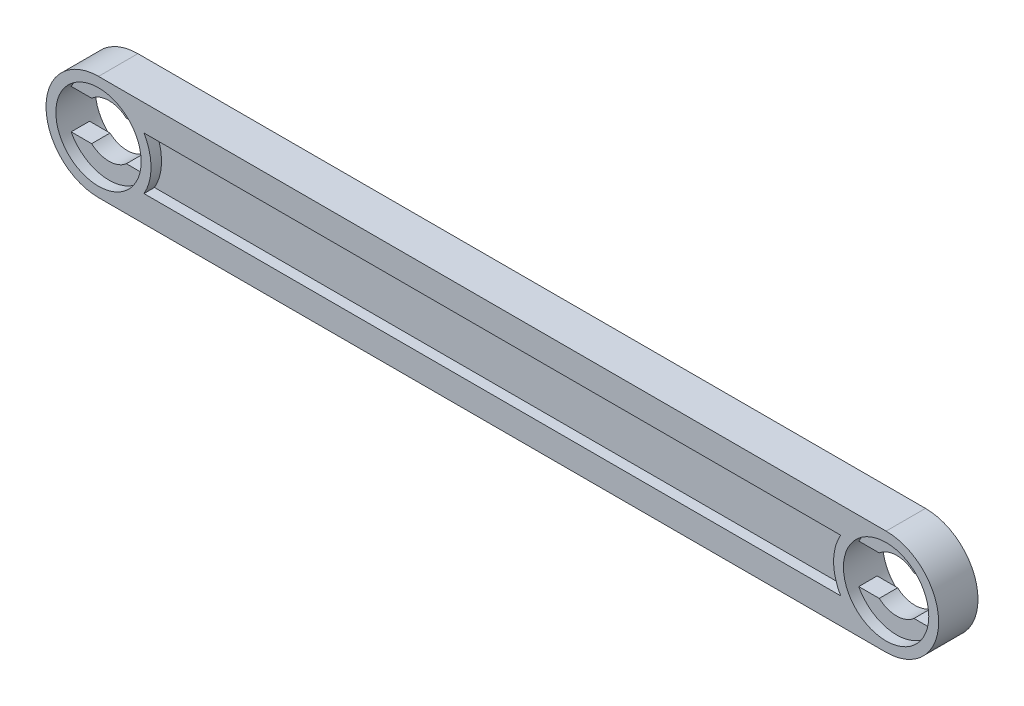
ISO-10303-21;
HEADER;
FILE_DESCRIPTION(('STEP AP214'),'2;1');
FILE_NAME('part.step','',(''),(''),'','','');
FILE_SCHEMA(('AUTOMOTIVE_DESIGN { 1 0 10303 214 1 1 1 1 }'));
ENDSEC;
DATA;
#1=APPLICATION_CONTEXT('core data for automotive mechanical design processes');
#2=APPLICATION_PROTOCOL_DEFINITION('international standard','automotive_design',2000,#1);
#3=PRODUCT_CONTEXT('',#1,'mechanical');
#4=PRODUCT('Part','Part','',(#3));
#5=PRODUCT_RELATED_PRODUCT_CATEGORY('part','',(#4));
#6=PRODUCT_DEFINITION_FORMATION('','',#4);
#7=PRODUCT_DEFINITION_CONTEXT('part definition',#1,'design');
#8=PRODUCT_DEFINITION('design','',#6,#7);
#9=PRODUCT_DEFINITION_SHAPE('','',#8);
#10=(LENGTH_UNIT() NAMED_UNIT(*) SI_UNIT(.MILLI.,.METRE.));
#11=(NAMED_UNIT(*) PLANE_ANGLE_UNIT() SI_UNIT($,.RADIAN.));
#12=(NAMED_UNIT(*) SI_UNIT($,.STERADIAN.) SOLID_ANGLE_UNIT());
#13=UNCERTAINTY_MEASURE_WITH_UNIT(LENGTH_MEASURE(1.E-05),#10,'distance_accuracy_value','');
#14=(GEOMETRIC_REPRESENTATION_CONTEXT(3) GLOBAL_UNCERTAINTY_ASSIGNED_CONTEXT((#13)) GLOBAL_UNIT_ASSIGNED_CONTEXT((#10,
#11,#12)) REPRESENTATION_CONTEXT('',''));
#15=CARTESIAN_POINT('',(0.,0.,0.));
#16=DIRECTION('',(0.,0.,1.));
#17=DIRECTION('',(1.,0.,0.));
#18=AXIS2_PLACEMENT_3D('',#15,#16,#17);
#19=CARTESIAN_POINT('',(0.,0.,0.));
#20=DIRECTION('',(0.,0.,1.));
#21=DIRECTION('',(1.,0.,0.));
#22=AXIS2_PLACEMENT_3D('',#19,#20,#21);
#23=PLANE('',#22);
#24=CARTESIAN_POINT('',(60.,0.,0.));
#25=DIRECTION('',(0.,0.,-1.));
#26=DIRECTION('',(1.,0.,0.));
#27=AXIS2_PLACEMENT_3D('',#24,#25,#26);
#28=CIRCLE('',#27,4.00000000000001);
#29=CARTESIAN_POINT('',(56.5358983848622,-2.,0.));
#30=VERTEX_POINT('',#29);
#31=CARTESIAN_POINT('',(56.5358983848622,2.,0.));
#32=VERTEX_POINT('',#31);
#33=EDGE_CURVE('E57',#30,#32,#28,.T.);
#34=ORIENTED_EDGE('',*,*,#33,.F.);
#35=DIRECTION('',(1.,0.,0.));
#36=VECTOR('',#35,1.);
#37=CARTESIAN_POINT('',(3.46410161513775,-2.,0.));
#38=LINE('',#37,#36);
#39=CARTESIAN_POINT('',(3.46410161513775,-2.,0.));
#40=VERTEX_POINT('',#39);
#41=EDGE_CURVE('E261',#40,#30,#38,.T.);
#42=ORIENTED_EDGE('',*,*,#41,.F.);
#43=CARTESIAN_POINT('',(0.,0.,0.));
#44=DIRECTION('',(0.,0.,-1.));
#45=DIRECTION('',(1.,0.,0.));
#46=AXIS2_PLACEMENT_3D('',#43,#44,#45);
#47=CIRCLE('',#46,4.);
#48=CARTESIAN_POINT('',(3.46410161513775,2.,0.));
#49=VERTEX_POINT('',#48);
#50=EDGE_CURVE('E275',#49,#40,#47,.T.);
#51=ORIENTED_EDGE('',*,*,#50,.F.);
#52=DIRECTION('',(-1.,0.,0.));
#53=VECTOR('',#52,1.);
#54=CARTESIAN_POINT('',(3.46410161513775,2.,0.));
#55=LINE('',#54,#53);
#56=EDGE_CURVE('E272',#32,#49,#55,.T.);
#57=ORIENTED_EDGE('',*,*,#56,.F.);
#58=EDGE_LOOP('',(#34,#42,#51,#57));
#59=FACE_BOUND('',#58,.T.);
#60=CARTESIAN_POINT('',(0.,0.,0.));
#61=DIRECTION('',(0.,0.,1.));
#62=DIRECTION('',(1.,0.,0.));
#63=AXIS2_PLACEMENT_3D('',#60,#61,#62);
#64=CIRCLE('',#63,4.);
#65=CARTESIAN_POINT('',(0.,4.,0.));
#66=VERTEX_POINT('',#65);
#67=CARTESIAN_POINT('',(0.,-4.,0.));
#68=VERTEX_POINT('',#67);
#69=EDGE_CURVE('E393',#66,#68,#64,.T.);
#70=ORIENTED_EDGE('',*,*,#69,.T.);
#71=DIRECTION('',(1.,0.,0.));
#72=VECTOR('',#71,1.);
#73=CARTESIAN_POINT('',(0.,-4.,0.));
#74=LINE('',#73,#72);
#75=CARTESIAN_POINT('',(60.,-4.,0.));
#76=VERTEX_POINT('',#75);
#77=EDGE_CURVE('E423',#68,#76,#74,.T.);
#78=ORIENTED_EDGE('',*,*,#77,.T.);
#79=CARTESIAN_POINT('',(60.,0.,0.));
#80=DIRECTION('',(0.,0.,1.));
#81=DIRECTION('',(1.,0.,0.));
#82=AXIS2_PLACEMENT_3D('',#79,#80,#81);
#83=CIRCLE('',#82,4.);
#84=CARTESIAN_POINT('',(60.,4.,0.));
#85=VERTEX_POINT('',#84);
#86=EDGE_CURVE('E426',#76,#85,#83,.T.);
#87=ORIENTED_EDGE('',*,*,#86,.T.);
#88=DIRECTION('',(-1.,0.,0.));
#89=VECTOR('',#88,1.);
#90=CARTESIAN_POINT('',(0.,4.,0.));
#91=LINE('',#90,#89);
#92=EDGE_CURVE('E411',#85,#66,#91,.T.);
#93=ORIENTED_EDGE('',*,*,#92,.T.);
#94=EDGE_LOOP('',(#70,#78,#87,#93));
#95=FACE_BOUND('',#94,.T.);
#96=CARTESIAN_POINT('',(0.,0.,0.));
#97=DIRECTION('',(0.,0.,1.));
#98=DIRECTION('',(1.,0.,0.));
#99=AXIS2_PLACEMENT_3D('',#96,#97,#98);
#100=CIRCLE('',#99,3.25);
#101=CARTESIAN_POINT('',(3.25,0.,0.));
#102=VERTEX_POINT('',#101);
#103=EDGE_CURVE('E387',#102,#102,#100,.T.);
#104=ORIENTED_EDGE('',*,*,#103,.F.);
#105=EDGE_LOOP('',(#104));
#106=FACE_BOUND('',#105,.T.);
#107=CARTESIAN_POINT('',(60.,0.,0.));
#108=DIRECTION('',(0.,0.,-1.));
#109=DIRECTION('',(-1.,0.,0.));
#110=AXIS2_PLACEMENT_3D('',#107,#108,#109);
#111=CIRCLE('',#110,3.25);
#112=CARTESIAN_POINT('',(56.75,0.,0.));
#113=VERTEX_POINT('',#112);
#114=EDGE_CURVE('E324',#113,#113,#111,.T.);
#115=ORIENTED_EDGE('',*,*,#114,.T.);
#116=EDGE_LOOP('',(#115));
#117=FACE_BOUND('',#116,.T.);
#118=ADVANCED_FACE('F34',(#59,#95,#106,#117),#23,.T.);
#119=CARTESIAN_POINT('',(62.8831406486677,-1.5,-3.001));
#120=DIRECTION('',(0.,1.,0.));
#121=DIRECTION('',(0.,0.,1.));
#122=AXIS2_PLACEMENT_3D('',#119,#120,#121);
#123=PLANE('',#122);
#124=DIRECTION('',(1.,0.,0.));
#125=VECTOR('',#124,1.);
#126=CARTESIAN_POINT('',(62.8831406486677,-1.5,-2.2));
#127=LINE('',#126,#125);
#128=CARTESIAN_POINT('',(61.3228756555323,-1.5,-2.2));
#129=VERTEX_POINT('',#128);
#130=CARTESIAN_POINT('',(62.8831406486677,-1.5,-2.2));
#131=VERTEX_POINT('',#130);
#132=EDGE_CURVE('E300',#129,#131,#127,.T.);
#133=ORIENTED_EDGE('',*,*,#132,.F.);
#134=DIRECTION('',(0.,0.,1.));
#135=VECTOR('',#134,1.);
#136=CARTESIAN_POINT('',(61.3228756555323,-1.5,-3.001));
#137=LINE('',#136,#135);
#138=CARTESIAN_POINT('',(61.3228756555323,-1.5,-0.8));
#139=VERTEX_POINT('',#138);
#140=EDGE_CURVE('E331',#129,#139,#137,.T.);
#141=ORIENTED_EDGE('',*,*,#140,.T.);
#142=DIRECTION('',(1.,0.,0.));
#143=VECTOR('',#142,1.);
#144=CARTESIAN_POINT('',(62.8831406486677,-1.5,-0.8));
#145=LINE('',#144,#143);
#146=CARTESIAN_POINT('',(62.8831406486677,-1.5,-0.8));
#147=VERTEX_POINT('',#146);
#148=EDGE_CURVE('E318',#139,#147,#145,.T.);
#149=ORIENTED_EDGE('',*,*,#148,.T.);
#150=DIRECTION('',(0.,0.,1.));
#151=VECTOR('',#150,1.);
#152=CARTESIAN_POINT('',(62.8831406486677,-1.5,-3.001));
#153=LINE('',#152,#151);
#154=EDGE_CURVE('E328',#131,#147,#153,.T.);
#155=ORIENTED_EDGE('',*,*,#154,.F.);
#156=EDGE_LOOP('',(#133,#141,#149,#155));
#157=FACE_BOUND('',#156,.T.);
#158=ADVANCED_FACE('F476',(#157),#123,.T.);
#159=CARTESIAN_POINT('',(60.,0.,-3.001));
#160=DIRECTION('',(0.,0.,1.));
#161=DIRECTION('',(1.,0.,0.));
#162=AXIS2_PLACEMENT_3D('',#159,#160,#161);
#163=CYLINDRICAL_SURFACE('',#162,2.);
#164=CARTESIAN_POINT('',(60.,0.,-2.2));
#165=DIRECTION('',(0.,0.,1.));
#166=DIRECTION('',(1.,0.,0.));
#167=AXIS2_PLACEMENT_3D('',#164,#165,#166);
#168=CIRCLE('',#167,2.);
#169=CARTESIAN_POINT('',(58.6771243444677,-1.5,-2.2));
#170=VERTEX_POINT('',#169);
#171=EDGE_CURVE('E298',#170,#129,#168,.T.);
#172=ORIENTED_EDGE('',*,*,#171,.F.);
#173=DIRECTION('',(0.,0.,1.));
#174=VECTOR('',#173,1.);
#175=CARTESIAN_POINT('',(58.6771243444677,-1.5,-3.001));
#176=LINE('',#175,#174);
#177=CARTESIAN_POINT('',(58.6771243444677,-1.5,-0.800000000000001));
#178=VERTEX_POINT('',#177);
#179=EDGE_CURVE('E333',#170,#178,#176,.T.);
#180=ORIENTED_EDGE('',*,*,#179,.T.);
#181=CARTESIAN_POINT('',(60.,0.,-0.8));
#182=DIRECTION('',(0.,0.,1.));
#183=DIRECTION('',(1.,0.,0.));
#184=AXIS2_PLACEMENT_3D('',#181,#182,#183);
#185=CIRCLE('',#184,2.);
#186=EDGE_CURVE('E315',#178,#139,#185,.T.);
#187=ORIENTED_EDGE('',*,*,#186,.T.);
#188=ORIENTED_EDGE('',*,*,#140,.F.);
#189=EDGE_LOOP('',(#172,#180,#187,#188));
#190=FACE_BOUND('',#189,.T.);
#191=ADVANCED_FACE('F482',(#190),#163,.F.);
#192=CARTESIAN_POINT('',(58.6771243444677,-1.5,-3.001));
#193=DIRECTION('',(0.,1.,0.));
#194=DIRECTION('',(0.,0.,1.));
#195=AXIS2_PLACEMENT_3D('',#192,#193,#194);
#196=PLANE('',#195);
#197=DIRECTION('',(1.,0.,0.));
#198=VECTOR('',#197,1.);
#199=CARTESIAN_POINT('',(58.6771243444677,-1.5,-2.2));
#200=LINE('',#199,#198);
#201=CARTESIAN_POINT('',(57.1168593513323,-1.5,-2.2));
#202=VERTEX_POINT('',#201);
#203=EDGE_CURVE('E296',#202,#170,#200,.T.);
#204=ORIENTED_EDGE('',*,*,#203,.F.);
#205=DIRECTION('',(0.,0.,1.));
#206=VECTOR('',#205,1.);
#207=CARTESIAN_POINT('',(57.1168593513323,-1.5,-3.001));
#208=LINE('',#207,#206);
#209=CARTESIAN_POINT('',(57.1168593513323,-1.5,-0.8));
#210=VERTEX_POINT('',#209);
#211=EDGE_CURVE('E335',#202,#210,#208,.T.);
#212=ORIENTED_EDGE('',*,*,#211,.T.);
#213=DIRECTION('',(1.,0.,0.));
#214=VECTOR('',#213,1.);
#215=CARTESIAN_POINT('',(58.6771243444677,-1.5,-0.8));
#216=LINE('',#215,#214);
#217=EDGE_CURVE('E312',#210,#178,#216,.T.);
#218=ORIENTED_EDGE('',*,*,#217,.T.);
#219=ORIENTED_EDGE('',*,*,#179,.F.);
#220=EDGE_LOOP('',(#204,#212,#218,#219));
#221=FACE_BOUND('',#220,.T.);
#222=ADVANCED_FACE('F586',(#221),#196,.T.);
#223=CARTESIAN_POINT('',(58.6771243444677,1.5,-3.001));
#224=DIRECTION('',(0.,-1.,0.));
#225=DIRECTION('',(0.,0.,-1.));
#226=AXIS2_PLACEMENT_3D('',#223,#224,#225);
#227=PLANE('',#226);
#228=DIRECTION('',(-1.,0.,0.));
#229=VECTOR('',#228,1.);
#230=CARTESIAN_POINT('',(58.6771243444677,1.5,-2.2));
#231=LINE('',#230,#229);
#232=CARTESIAN_POINT('',(58.6771243444677,1.5,-2.2));
#233=VERTEX_POINT('',#232);
#234=CARTESIAN_POINT('',(57.1168593513323,1.5,-2.2));
#235=VERTEX_POINT('',#234);
#236=EDGE_CURVE('E294',#233,#235,#231,.T.);
#237=ORIENTED_EDGE('',*,*,#236,.F.);
#238=DIRECTION('',(0.,0.,1.));
#239=VECTOR('',#238,1.);
#240=CARTESIAN_POINT('',(58.6771243444677,1.5,-3.001));
#241=LINE('',#240,#239);
#242=CARTESIAN_POINT('',(58.6771243444677,1.5,-0.8));
#243=VERTEX_POINT('',#242);
#244=EDGE_CURVE('E339',#233,#243,#241,.T.);
#245=ORIENTED_EDGE('',*,*,#244,.T.);
#246=DIRECTION('',(-1.,0.,0.));
#247=VECTOR('',#246,1.);
#248=CARTESIAN_POINT('',(58.6771243444677,1.5,-0.8));
#249=LINE('',#248,#247);
#250=CARTESIAN_POINT('',(57.1168593513323,1.5,-0.8));
#251=VERTEX_POINT('',#250);
#252=EDGE_CURVE('E309',#243,#251,#249,.T.);
#253=ORIENTED_EDGE('',*,*,#252,.T.);
#254=DIRECTION('',(0.,0.,1.));
#255=VECTOR('',#254,1.);
#256=CARTESIAN_POINT('',(57.1168593513323,1.5,-3.001));
#257=LINE('',#256,#255);
#258=EDGE_CURVE('E337',#235,#251,#257,.T.);
#259=ORIENTED_EDGE('',*,*,#258,.F.);
#260=EDGE_LOOP('',(#237,#245,#253,#259));
#261=FACE_BOUND('',#260,.T.);
#262=ADVANCED_FACE('F590',(#261),#227,.T.);
#263=CARTESIAN_POINT('',(60.,0.,-3.001));
#264=DIRECTION('',(0.,0.,1.));
#265=DIRECTION('',(1.,0.,0.));
#266=AXIS2_PLACEMENT_3D('',#263,#264,#265);
#267=CYLINDRICAL_SURFACE('',#266,2.);
#268=CARTESIAN_POINT('',(60.,0.,-2.2));
#269=DIRECTION('',(0.,0.,1.));
#270=DIRECTION('',(1.,0.,0.));
#271=AXIS2_PLACEMENT_3D('',#268,#269,#270);
#272=CIRCLE('',#271,2.);
#273=CARTESIAN_POINT('',(61.3228756555323,1.5,-2.2));
#274=VERTEX_POINT('',#273);
#275=EDGE_CURVE('E292',#274,#233,#272,.T.);
#276=ORIENTED_EDGE('',*,*,#275,.F.);
#277=DIRECTION('',(0.,0.,1.));
#278=VECTOR('',#277,1.);
#279=CARTESIAN_POINT('',(61.3228756555323,1.5,-3.001));
#280=LINE('',#279,#278);
#281=CARTESIAN_POINT('',(61.3228756555323,1.5,-0.800000000000001));
#282=VERTEX_POINT('',#281);
#283=EDGE_CURVE('E341',#274,#282,#280,.T.);
#284=ORIENTED_EDGE('',*,*,#283,.T.);
#285=CARTESIAN_POINT('',(60.,0.,-0.8));
#286=DIRECTION('',(0.,0.,1.));
#287=DIRECTION('',(1.,0.,0.));
#288=AXIS2_PLACEMENT_3D('',#285,#286,#287);
#289=CIRCLE('',#288,2.);
#290=EDGE_CURVE('E306',#282,#243,#289,.T.);
#291=ORIENTED_EDGE('',*,*,#290,.T.);
#292=ORIENTED_EDGE('',*,*,#244,.F.);
#293=EDGE_LOOP('',(#276,#284,#291,#292));
#294=FACE_BOUND('',#293,.T.);
#295=ADVANCED_FACE('F532',(#294),#267,.F.);
#296=CARTESIAN_POINT('',(62.8831406486677,1.5,-3.001));
#297=DIRECTION('',(0.,-1.,0.));
#298=DIRECTION('',(0.,0.,-1.));
#299=AXIS2_PLACEMENT_3D('',#296,#297,#298);
#300=PLANE('',#299);
#301=DIRECTION('',(-1.,0.,0.));
#302=VECTOR('',#301,1.);
#303=CARTESIAN_POINT('',(62.8831406486677,1.5,-2.2));
#304=LINE('',#303,#302);
#305=CARTESIAN_POINT('',(62.8831406486677,1.5,-2.2));
#306=VERTEX_POINT('',#305);
#307=EDGE_CURVE('E290',#306,#274,#304,.T.);
#308=ORIENTED_EDGE('',*,*,#307,.F.);
#309=DIRECTION('',(0.,0.,1.));
#310=VECTOR('',#309,1.);
#311=CARTESIAN_POINT('',(62.8831406486677,1.5,-3.001));
#312=LINE('',#311,#310);
#313=CARTESIAN_POINT('',(62.8831406486677,1.5,-0.8));
#314=VERTEX_POINT('',#313);
#315=EDGE_CURVE('E327',#306,#314,#312,.T.);
#316=ORIENTED_EDGE('',*,*,#315,.T.);
#317=DIRECTION('',(-1.,0.,0.));
#318=VECTOR('',#317,1.);
#319=CARTESIAN_POINT('',(62.8831406486677,1.5,-0.8));
#320=LINE('',#319,#318);
#321=EDGE_CURVE('E11',#314,#282,#320,.T.);
#322=ORIENTED_EDGE('',*,*,#321,.T.);
#323=ORIENTED_EDGE('',*,*,#283,.F.);
#324=EDGE_LOOP('',(#308,#316,#322,#323));
#325=FACE_BOUND('',#324,.T.);
#326=ADVANCED_FACE('F518',(#325),#300,.T.);
#327=CARTESIAN_POINT('',(0.,0.,-3.));
#328=DIRECTION('',(0.,0.,1.));
#329=DIRECTION('',(1.,0.,0.));
#330=AXIS2_PLACEMENT_3D('',#327,#328,#329);
#331=PLANE('',#330);
#332=DIRECTION('',(-1.,0.,0.));
#333=VECTOR('',#332,1.);
#334=CARTESIAN_POINT('',(56.,-2.,-3.));
#335=LINE('',#334,#333);
#336=CARTESIAN_POINT('',(56.,-2.,-3.));
#337=VERTEX_POINT('',#336);
#338=CARTESIAN_POINT('',(4.,-2.,-3.));
#339=VERTEX_POINT('',#338);
#340=EDGE_CURVE('E248',#337,#339,#335,.T.);
#341=ORIENTED_EDGE('',*,*,#340,.F.);
#342=DIRECTION('',(0.,-1.,0.));
#343=VECTOR('',#342,1.);
#344=CARTESIAN_POINT('',(56.,-2.,-3.));
#345=LINE('',#344,#343);
#346=CARTESIAN_POINT('',(56.,2.,-3.));
#347=VERTEX_POINT('',#346);
#348=EDGE_CURVE('E49',#347,#337,#345,.T.);
#349=ORIENTED_EDGE('',*,*,#348,.F.);
#350=DIRECTION('',(1.,0.,0.));
#351=VECTOR('',#350,1.);
#352=CARTESIAN_POINT('',(56.,2.,-3.));
#353=LINE('',#352,#351);
#354=CARTESIAN_POINT('',(4.,2.,-3.));
#355=VERTEX_POINT('',#354);
#356=EDGE_CURVE('E239',#355,#347,#353,.T.);
#357=ORIENTED_EDGE('',*,*,#356,.F.);
#358=DIRECTION('',(0.,1.,0.));
#359=VECTOR('',#358,1.);
#360=CARTESIAN_POINT('',(4.,-2.,-3.));
#361=LINE('',#360,#359);
#362=EDGE_CURVE('E242',#339,#355,#361,.T.);
#363=ORIENTED_EDGE('',*,*,#362,.F.);
#364=EDGE_LOOP('',(#341,#349,#357,#363));
#365=FACE_BOUND('',#364,.T.);
#366=CARTESIAN_POINT('',(0.,0.,-3.));
#367=DIRECTION('',(0.,0.,1.));
#368=DIRECTION('',(1.,0.,0.));
#369=AXIS2_PLACEMENT_3D('',#366,#367,#368);
#370=CIRCLE('',#369,3.25);
#371=CARTESIAN_POINT('',(3.25,0.,-3.));
#372=VERTEX_POINT('',#371);
#373=EDGE_CURVE('E384',#372,#372,#370,.F.);
#374=ORIENTED_EDGE('',*,*,#373,.F.);
#375=EDGE_LOOP('',(#374));
#376=FACE_BOUND('',#375,.T.);
#377=CARTESIAN_POINT('',(0.,0.,-3.));
#378=DIRECTION('',(0.,0.,1.));
#379=DIRECTION('',(1.,0.,0.));
#380=AXIS2_PLACEMENT_3D('',#377,#378,#379);
#381=CIRCLE('',#380,4.);
#382=CARTESIAN_POINT('',(0.,4.,-3.));
#383=VERTEX_POINT('',#382);
#384=CARTESIAN_POINT('',(0.,-4.,-3.));
#385=VERTEX_POINT('',#384);
#386=EDGE_CURVE('E407',#383,#385,#381,.T.);
#387=ORIENTED_EDGE('',*,*,#386,.F.);
#388=DIRECTION('',(-1.,0.,0.));
#389=VECTOR('',#388,1.);
#390=CARTESIAN_POINT('',(0.,4.,-3.));
#391=LINE('',#390,#389);
#392=CARTESIAN_POINT('',(60.,4.,-3.));
#393=VERTEX_POINT('',#392);
#394=EDGE_CURVE('E417',#393,#383,#391,.T.);
#395=ORIENTED_EDGE('',*,*,#394,.F.);
#396=CARTESIAN_POINT('',(60.,0.,-3.));
#397=DIRECTION('',(0.,0.,1.));
#398=DIRECTION('',(1.,0.,0.));
#399=AXIS2_PLACEMENT_3D('',#396,#397,#398);
#400=CIRCLE('',#399,4.);
#401=CARTESIAN_POINT('',(60.,-4.,-3.));
#402=VERTEX_POINT('',#401);
#403=EDGE_CURVE('E414',#402,#393,#400,.T.);
#404=ORIENTED_EDGE('',*,*,#403,.F.);
#405=DIRECTION('',(1.,0.,0.));
#406=VECTOR('',#405,1.);
#407=CARTESIAN_POINT('',(0.,-4.,-3.));
#408=LINE('',#407,#406);
#409=EDGE_CURVE('E410',#385,#402,#408,.T.);
#410=ORIENTED_EDGE('',*,*,#409,.F.);
#411=EDGE_LOOP('',(#387,#395,#404,#410));
#412=FACE_BOUND('',#411,.T.);
#413=CARTESIAN_POINT('',(60.,0.,-3.));
#414=DIRECTION('',(0.,0.,1.));
#415=DIRECTION('',(1.,0.,0.));
#416=AXIS2_PLACEMENT_3D('',#413,#414,#415);
#417=CIRCLE('',#416,3.25);
#418=CARTESIAN_POINT('',(63.25,0.,-3.));
#419=VERTEX_POINT('',#418);
#420=EDGE_CURVE('E321',#419,#419,#417,.T.);
#421=ORIENTED_EDGE('',*,*,#420,.T.);
#422=EDGE_LOOP('',(#421));
#423=FACE_BOUND('',#422,.T.);
#424=ADVANCED_FACE('F488',(#365,#376,#412,#423),#331,.F.);
#425=CARTESIAN_POINT('',(-2.8831406486677,1.5,-3.001));
#426=DIRECTION('',(0.,1.,0.));
#427=DIRECTION('',(0.,0.,1.));
#428=AXIS2_PLACEMENT_3D('',#425,#426,#427);
#429=PLANE('',#428);
#430=DIRECTION('',(0.,0.,1.));
#431=VECTOR('',#430,1.);
#432=CARTESIAN_POINT('',(-2.8831406486677,1.5,-3.001));
#433=LINE('',#432,#431);
#434=CARTESIAN_POINT('',(-2.8831406486677,1.5,-2.2));
#435=VERTEX_POINT('',#434);
#436=CARTESIAN_POINT('',(-2.8831406486677,1.5,-0.8));
#437=VERTEX_POINT('',#436);
#438=EDGE_CURVE('E391',#435,#437,#433,.T.);
#439=ORIENTED_EDGE('',*,*,#438,.F.);
#440=DIRECTION('',(1.,0.,0.));
#441=VECTOR('',#440,1.);
#442=CARTESIAN_POINT('',(-2.8831406486677,1.5,-2.2));
#443=LINE('',#442,#441);
#444=CARTESIAN_POINT('',(-1.3228756555323,1.5,-2.2));
#445=VERTEX_POINT('',#444);
#446=EDGE_CURVE('E362',#435,#445,#443,.T.);
#447=ORIENTED_EDGE('',*,*,#446,.T.);
#448=DIRECTION('',(0.,0.,1.));
#449=VECTOR('',#448,1.);
#450=CARTESIAN_POINT('',(-1.3228756555323,1.5,-3.001));
#451=LINE('',#450,#449);
#452=CARTESIAN_POINT('',(-1.3228756555323,1.5,-0.8));
#453=VERTEX_POINT('',#452);
#454=EDGE_CURVE('E394',#445,#453,#451,.T.);
#455=ORIENTED_EDGE('',*,*,#454,.T.);
#456=DIRECTION('',(1.,0.,0.));
#457=VECTOR('',#456,1.);
#458=CARTESIAN_POINT('',(-2.8831406486677,1.5,-0.8));
#459=LINE('',#458,#457);
#460=EDGE_CURVE('E381',#437,#453,#459,.T.);
#461=ORIENTED_EDGE('',*,*,#460,.F.);
#462=EDGE_LOOP('',(#439,#447,#455,#461));
#463=FACE_BOUND('',#462,.T.);
#464=ADVANCED_FACE('F517',(#463),#429,.F.);
#465=CARTESIAN_POINT('',(0.,0.,-3.001));
#466=DIRECTION('',(0.,0.,1.));
#467=DIRECTION('',(1.,0.,0.));
#468=AXIS2_PLACEMENT_3D('',#465,#466,#467);
#469=CYLINDRICAL_SURFACE('',#468,2.);
#470=ORIENTED_EDGE('',*,*,#454,.F.);
#471=CARTESIAN_POINT('',(0.,0.,-2.2));
#472=DIRECTION('',(0.,0.,1.));
#473=DIRECTION('',(1.,0.,0.));
#474=AXIS2_PLACEMENT_3D('',#471,#472,#473);
#475=CIRCLE('',#474,2.);
#476=CARTESIAN_POINT('',(1.3228756555323,1.5,-2.2));
#477=VERTEX_POINT('',#476);
#478=EDGE_CURVE('E359',#445,#477,#475,.F.);
#479=ORIENTED_EDGE('',*,*,#478,.T.);
#480=DIRECTION('',(0.,0.,1.));
#481=VECTOR('',#480,1.);
#482=CARTESIAN_POINT('',(1.3228756555323,1.5,-3.001));
#483=LINE('',#482,#481);
#484=CARTESIAN_POINT('',(1.3228756555323,1.5,-0.800000000000001));
#485=VERTEX_POINT('',#484);
#486=EDGE_CURVE('E396',#477,#485,#483,.T.);
#487=ORIENTED_EDGE('',*,*,#486,.T.);
#488=CARTESIAN_POINT('',(0.,0.,-0.8));
#489=DIRECTION('',(0.,0.,1.));
#490=DIRECTION('',(1.,0.,0.));
#491=AXIS2_PLACEMENT_3D('',#488,#489,#490);
#492=CIRCLE('',#491,2.);
#493=EDGE_CURVE('E378',#453,#485,#492,.F.);
#494=ORIENTED_EDGE('',*,*,#493,.F.);
#495=EDGE_LOOP('',(#470,#479,#487,#494));
#496=FACE_BOUND('',#495,.T.);
#497=ADVANCED_FACE('F529',(#496),#469,.F.);
#498=CARTESIAN_POINT('',(1.3228756555323,1.5,-3.001));
#499=DIRECTION('',(0.,1.,0.));
#500=DIRECTION('',(0.,0.,1.));
#501=AXIS2_PLACEMENT_3D('',#498,#499,#500);
#502=PLANE('',#501);
#503=ORIENTED_EDGE('',*,*,#486,.F.);
#504=DIRECTION('',(1.,0.,0.));
#505=VECTOR('',#504,1.);
#506=CARTESIAN_POINT('',(1.3228756555323,1.5,-2.2));
#507=LINE('',#506,#505);
#508=CARTESIAN_POINT('',(2.8831406486677,1.5,-2.2));
#509=VERTEX_POINT('',#508);
#510=EDGE_CURVE('E356',#477,#509,#507,.T.);
#511=ORIENTED_EDGE('',*,*,#510,.T.);
#512=DIRECTION('',(0.,0.,1.));
#513=VECTOR('',#512,1.);
#514=CARTESIAN_POINT('',(2.8831406486677,1.5,-3.001));
#515=LINE('',#514,#513);
#516=CARTESIAN_POINT('',(2.8831406486677,1.5,-0.8));
#517=VERTEX_POINT('',#516);
#518=EDGE_CURVE('E398',#509,#517,#515,.T.);
#519=ORIENTED_EDGE('',*,*,#518,.T.);
#520=DIRECTION('',(1.,0.,0.));
#521=VECTOR('',#520,1.);
#522=CARTESIAN_POINT('',(1.3228756555323,1.5,-0.8));
#523=LINE('',#522,#521);
#524=EDGE_CURVE('E375',#485,#517,#523,.T.);
#525=ORIENTED_EDGE('',*,*,#524,.F.);
#526=EDGE_LOOP('',(#503,#511,#519,#525));
#527=FACE_BOUND('',#526,.T.);
#528=ADVANCED_FACE('F807',(#527),#502,.F.);
#529=CARTESIAN_POINT('',(1.3228756555323,-1.5,-3.001));
#530=DIRECTION('',(0.,-1.,0.));
#531=DIRECTION('',(0.,0.,-1.));
#532=AXIS2_PLACEMENT_3D('',#529,#530,#531);
#533=PLANE('',#532);
#534=DIRECTION('',(0.,0.,1.));
#535=VECTOR('',#534,1.);
#536=CARTESIAN_POINT('',(2.8831406486677,-1.5,-3.001));
#537=LINE('',#536,#535);
#538=CARTESIAN_POINT('',(2.8831406486677,-1.5,-2.2));
#539=VERTEX_POINT('',#538);
#540=CARTESIAN_POINT('',(2.8831406486677,-1.5,-0.8));
#541=VERTEX_POINT('',#540);
#542=EDGE_CURVE('E400',#539,#541,#537,.T.);
#543=ORIENTED_EDGE('',*,*,#542,.F.);
#544=DIRECTION('',(-1.,0.,0.));
#545=VECTOR('',#544,1.);
#546=CARTESIAN_POINT('',(1.3228756555323,-1.5,-2.2));
#547=LINE('',#546,#545);
#548=CARTESIAN_POINT('',(1.32287565553229,-1.5,-2.2));
#549=VERTEX_POINT('',#548);
#550=EDGE_CURVE('E353',#539,#549,#547,.T.);
#551=ORIENTED_EDGE('',*,*,#550,.T.);
#552=DIRECTION('',(0.,0.,1.));
#553=VECTOR('',#552,1.);
#554=CARTESIAN_POINT('',(1.32287565553229,-1.5,-3.001));
#555=LINE('',#554,#553);
#556=CARTESIAN_POINT('',(1.32287565553229,-1.5,-0.8));
#557=VERTEX_POINT('',#556);
#558=EDGE_CURVE('E402',#549,#557,#555,.T.);
#559=ORIENTED_EDGE('',*,*,#558,.T.);
#560=DIRECTION('',(-1.,0.,0.));
#561=VECTOR('',#560,1.);
#562=CARTESIAN_POINT('',(1.3228756555323,-1.5,-0.8));
#563=LINE('',#562,#561);
#564=EDGE_CURVE('E372',#541,#557,#563,.T.);
#565=ORIENTED_EDGE('',*,*,#564,.F.);
#566=EDGE_LOOP('',(#543,#551,#559,#565));
#567=FACE_BOUND('',#566,.T.);
#568=ADVANCED_FACE('F454',(#567),#533,.F.);
#569=CARTESIAN_POINT('',(0.,0.,-3.001));
#570=DIRECTION('',(0.,0.,1.));
#571=DIRECTION('',(1.,0.,0.));
#572=AXIS2_PLACEMENT_3D('',#569,#570,#571);
#573=CYLINDRICAL_SURFACE('',#572,2.);
#574=ORIENTED_EDGE('',*,*,#558,.F.);
#575=CARTESIAN_POINT('',(0.,0.,-2.2));
#576=DIRECTION('',(0.,0.,1.));
#577=DIRECTION('',(1.,0.,0.));
#578=AXIS2_PLACEMENT_3D('',#575,#576,#577);
#579=CIRCLE('',#578,2.);
#580=CARTESIAN_POINT('',(-1.3228756555323,-1.5,-2.2));
#581=VERTEX_POINT('',#580);
#582=EDGE_CURVE('E350',#549,#581,#579,.F.);
#583=ORIENTED_EDGE('',*,*,#582,.T.);
#584=DIRECTION('',(0.,0.,1.));
#585=VECTOR('',#584,1.);
#586=CARTESIAN_POINT('',(-1.3228756555323,-1.5,-3.001));
#587=LINE('',#586,#585);
#588=CARTESIAN_POINT('',(-1.3228756555323,-1.5,-0.800000000000001));
#589=VERTEX_POINT('',#588);
#590=EDGE_CURVE('E404',#581,#589,#587,.T.);
#591=ORIENTED_EDGE('',*,*,#590,.T.);
#592=CARTESIAN_POINT('',(0.,0.,-0.8));
#593=DIRECTION('',(0.,0.,1.));
#594=DIRECTION('',(1.,0.,0.));
#595=AXIS2_PLACEMENT_3D('',#592,#593,#594);
#596=CIRCLE('',#595,2.);
#597=EDGE_CURVE('E369',#557,#589,#596,.F.);
#598=ORIENTED_EDGE('',*,*,#597,.F.);
#599=EDGE_LOOP('',(#574,#583,#591,#598));
#600=FACE_BOUND('',#599,.T.);
#601=ADVANCED_FACE('F457',(#600),#573,.F.);
#602=CARTESIAN_POINT('',(-2.8831406486677,-1.5,-3.001));
#603=DIRECTION('',(0.,-1.,0.));
#604=DIRECTION('',(0.,0.,-1.));
#605=AXIS2_PLACEMENT_3D('',#602,#603,#604);
#606=PLANE('',#605);
#607=ORIENTED_EDGE('',*,*,#590,.F.);
#608=DIRECTION('',(-1.,0.,0.));
#609=VECTOR('',#608,1.);
#610=CARTESIAN_POINT('',(-2.8831406486677,-1.5,-2.2));
#611=LINE('',#610,#609);
#612=CARTESIAN_POINT('',(-2.8831406486677,-1.5,-2.2));
#613=VERTEX_POINT('',#612);
#614=EDGE_CURVE('E347',#581,#613,#611,.T.);
#615=ORIENTED_EDGE('',*,*,#614,.T.);
#616=DIRECTION('',(0.,0.,1.));
#617=VECTOR('',#616,1.);
#618=CARTESIAN_POINT('',(-2.8831406486677,-1.5,-3.001));
#619=LINE('',#618,#617);
#620=CARTESIAN_POINT('',(-2.8831406486677,-1.5,-0.8));
#621=VERTEX_POINT('',#620);
#622=EDGE_CURVE('E390',#613,#621,#619,.T.);
#623=ORIENTED_EDGE('',*,*,#622,.T.);
#624=DIRECTION('',(-1.,0.,0.));
#625=VECTOR('',#624,1.);
#626=CARTESIAN_POINT('',(-2.8831406486677,-1.5,-0.8));
#627=LINE('',#626,#625);
#628=EDGE_CURVE('E42',#589,#621,#627,.T.);
#629=ORIENTED_EDGE('',*,*,#628,.F.);
#630=EDGE_LOOP('',(#607,#615,#623,#629));
#631=FACE_BOUND('',#630,.T.);
#632=ADVANCED_FACE('F458',(#631),#606,.F.);
#633=CARTESIAN_POINT('',(0.,0.,-3.));
#634=DIRECTION('',(0.,0.,1.));
#635=DIRECTION('',(1.,0.,0.));
#636=AXIS2_PLACEMENT_3D('',#633,#634,#635);
#637=CYLINDRICAL_SURFACE('',#636,4.);
#638=ORIENTED_EDGE('',*,*,#69,.F.);
#639=DIRECTION('',(0.,0.,1.));
#640=VECTOR('',#639,1.);
#641=CARTESIAN_POINT('',(0.,4.,-3.));
#642=LINE('',#641,#640);
#643=EDGE_CURVE('E431',#383,#66,#642,.T.);
#644=ORIENTED_EDGE('',*,*,#643,.F.);
#645=ORIENTED_EDGE('',*,*,#386,.T.);
#646=DIRECTION('',(0.,0.,1.));
#647=VECTOR('',#646,1.);
#648=CARTESIAN_POINT('',(0.,-4.,-3.));
#649=LINE('',#648,#647);
#650=EDGE_CURVE('E420',#385,#68,#649,.T.);
#651=ORIENTED_EDGE('',*,*,#650,.T.);
#652=EDGE_LOOP('',(#638,#644,#645,#651));
#653=FACE_BOUND('',#652,.T.);
#654=ADVANCED_FACE('F36',(#653),#637,.T.);
#655=CARTESIAN_POINT('',(0.,4.,-3.));
#656=DIRECTION('',(0.,1.,0.));
#657=DIRECTION('',(0.,0.,1.));
#658=AXIS2_PLACEMENT_3D('',#655,#656,#657);
#659=PLANE('',#658);
#660=ORIENTED_EDGE('',*,*,#92,.F.);
#661=DIRECTION('',(0.,0.,1.));
#662=VECTOR('',#661,1.);
#663=CARTESIAN_POINT('',(60.,4.,-3.));
#664=LINE('',#663,#662);
#665=EDGE_CURVE('E433',#393,#85,#664,.T.);
#666=ORIENTED_EDGE('',*,*,#665,.F.);
#667=ORIENTED_EDGE('',*,*,#394,.T.);
#668=ORIENTED_EDGE('',*,*,#643,.T.);
#669=EDGE_LOOP('',(#660,#666,#667,#668));
#670=FACE_BOUND('',#669,.T.);
#671=ADVANCED_FACE('F490',(#670),#659,.T.);
#672=CARTESIAN_POINT('',(60.,0.,-3.));
#673=DIRECTION('',(0.,0.,1.));
#674=DIRECTION('',(1.,0.,0.));
#675=AXIS2_PLACEMENT_3D('',#672,#673,#674);
#676=CYLINDRICAL_SURFACE('',#675,4.);
#677=ORIENTED_EDGE('',*,*,#86,.F.);
#678=DIRECTION('',(0.,0.,1.));
#679=VECTOR('',#678,1.);
#680=CARTESIAN_POINT('',(60.,-4.,-3.));
#681=LINE('',#680,#679);
#682=EDGE_CURVE('E435',#402,#76,#681,.T.);
#683=ORIENTED_EDGE('',*,*,#682,.F.);
#684=ORIENTED_EDGE('',*,*,#403,.T.);
#685=ORIENTED_EDGE('',*,*,#665,.T.);
#686=EDGE_LOOP('',(#677,#683,#684,#685));
#687=FACE_BOUND('',#686,.T.);
#688=ADVANCED_FACE('F493',(#687),#676,.T.);
#689=CARTESIAN_POINT('',(0.,-4.,-3.));
#690=DIRECTION('',(0.,-1.,0.));
#691=DIRECTION('',(0.,0.,-1.));
#692=AXIS2_PLACEMENT_3D('',#689,#690,#691);
#693=PLANE('',#692);
#694=ORIENTED_EDGE('',*,*,#77,.F.);
#695=ORIENTED_EDGE('',*,*,#650,.F.);
#696=ORIENTED_EDGE('',*,*,#409,.T.);
#697=ORIENTED_EDGE('',*,*,#682,.T.);
#698=EDGE_LOOP('',(#694,#695,#696,#697));
#699=FACE_BOUND('',#698,.T.);
#700=ADVANCED_FACE('F496',(#699),#693,.T.);
#701=CARTESIAN_POINT('',(0.,0.,-3.001));
#702=DIRECTION('',(0.,0.,1.));
#703=DIRECTION('',(1.,0.,0.));
#704=AXIS2_PLACEMENT_3D('',#701,#702,#703);
#705=CYLINDRICAL_SURFACE('',#704,3.25);
#706=CARTESIAN_POINT('',(0.,0.,-2.2));
#707=DIRECTION('',(0.,0.,1.));
#708=DIRECTION('',(1.,0.,0.));
#709=AXIS2_PLACEMENT_3D('',#706,#707,#708);
#710=CIRCLE('',#709,3.25);
#711=EDGE_CURVE('E344',#509,#435,#710,.T.);
#712=ORIENTED_EDGE('',*,*,#711,.T.);
#713=ORIENTED_EDGE('',*,*,#438,.T.);
#714=CARTESIAN_POINT('',(0.,0.,-0.8));
#715=DIRECTION('',(0.,0.,1.));
#716=DIRECTION('',(1.,0.,0.));
#717=AXIS2_PLACEMENT_3D('',#714,#715,#716);
#718=CIRCLE('',#717,3.25);
#719=EDGE_CURVE('E366',#517,#437,#718,.T.);
#720=ORIENTED_EDGE('',*,*,#719,.F.);
#721=ORIENTED_EDGE('',*,*,#518,.F.);
#722=EDGE_LOOP('',(#712,#713,#720,#721));
#723=FACE_BOUND('',#722,.T.);
#724=EDGE_CURVE('E330',#613,#539,#710,.T.);
#725=ORIENTED_EDGE('',*,*,#724,.T.);
#726=ORIENTED_EDGE('',*,*,#542,.T.);
#727=EDGE_CURVE('E365',#621,#541,#718,.T.);
#728=ORIENTED_EDGE('',*,*,#727,.F.);
#729=ORIENTED_EDGE('',*,*,#622,.F.);
#730=EDGE_LOOP('',(#725,#726,#728,#729));
#731=FACE_BOUND('',#730,.T.);
#732=ORIENTED_EDGE('',*,*,#103,.T.);
#733=EDGE_LOOP('',(#732));
#734=FACE_BOUND('',#733,.T.);
#735=ORIENTED_EDGE('',*,*,#373,.T.);
#736=EDGE_LOOP('',(#735));
#737=FACE_BOUND('',#736,.T.);
#738=ADVANCED_FACE('F450',(#723,#731,#734,#737),#705,.F.);
#739=CARTESIAN_POINT('',(0.,0.,-0.8));
#740=DIRECTION('',(0.,0.,1.));
#741=DIRECTION('',(1.,0.,0.));
#742=AXIS2_PLACEMENT_3D('',#739,#740,#741);
#743=PLANE('',#742);
#744=ORIENTED_EDGE('',*,*,#564,.T.);
#745=ORIENTED_EDGE('',*,*,#597,.T.);
#746=ORIENTED_EDGE('',*,*,#628,.T.);
#747=ORIENTED_EDGE('',*,*,#727,.T.);
#748=EDGE_LOOP('',(#744,#745,#746,#747));
#749=FACE_BOUND('',#748,.T.);
#750=ADVANCED_FACE('F442',(#749),#743,.T.);
#751=ORIENTED_EDGE('',*,*,#460,.T.);
#752=ORIENTED_EDGE('',*,*,#493,.T.);
#753=ORIENTED_EDGE('',*,*,#524,.T.);
#754=ORIENTED_EDGE('',*,*,#719,.T.);
#755=EDGE_LOOP('',(#751,#752,#753,#754));
#756=FACE_BOUND('',#755,.T.);
#757=ADVANCED_FACE('F472',(#756),#743,.T.);
#758=CARTESIAN_POINT('',(0.,0.,-2.2));
#759=DIRECTION('',(0.,0.,1.));
#760=DIRECTION('',(1.,0.,0.));
#761=AXIS2_PLACEMENT_3D('',#758,#759,#760);
#762=PLANE('',#761);
#763=ORIENTED_EDGE('',*,*,#711,.F.);
#764=ORIENTED_EDGE('',*,*,#510,.F.);
#765=ORIENTED_EDGE('',*,*,#478,.F.);
#766=ORIENTED_EDGE('',*,*,#446,.F.);
#767=EDGE_LOOP('',(#763,#764,#765,#766));
#768=FACE_BOUND('',#767,.T.);
#769=ADVANCED_FACE('F463',(#768),#762,.F.);
#770=ORIENTED_EDGE('',*,*,#724,.F.);
#771=ORIENTED_EDGE('',*,*,#614,.F.);
#772=ORIENTED_EDGE('',*,*,#582,.F.);
#773=ORIENTED_EDGE('',*,*,#550,.F.);
#774=EDGE_LOOP('',(#770,#771,#772,#773));
#775=FACE_BOUND('',#774,.T.);
#776=ADVANCED_FACE('F460',(#775),#762,.F.);
#777=CARTESIAN_POINT('',(60.,0.,-3.001));
#778=DIRECTION('',(0.,0.,1.));
#779=DIRECTION('',(1.,0.,0.));
#780=AXIS2_PLACEMENT_3D('',#777,#778,#779);
#781=CYLINDRICAL_SURFACE('',#780,3.25);
#782=CARTESIAN_POINT('',(60.,0.,-2.2));
#783=DIRECTION('',(0.,0.,-1.));
#784=DIRECTION('',(-1.,0.,0.));
#785=AXIS2_PLACEMENT_3D('',#782,#783,#784);
#786=CIRCLE('',#785,3.25);
#787=EDGE_CURVE('E282',#131,#202,#786,.T.);
#788=ORIENTED_EDGE('',*,*,#787,.F.);
#789=ORIENTED_EDGE('',*,*,#154,.T.);
#790=CARTESIAN_POINT('',(60.,0.,-0.8));
#791=DIRECTION('',(0.,0.,-1.));
#792=DIRECTION('',(-1.,0.,0.));
#793=AXIS2_PLACEMENT_3D('',#790,#791,#792);
#794=CIRCLE('',#793,3.25);
#795=EDGE_CURVE('E302',#147,#210,#794,.T.);
#796=ORIENTED_EDGE('',*,*,#795,.T.);
#797=ORIENTED_EDGE('',*,*,#211,.F.);
#798=EDGE_LOOP('',(#788,#789,#796,#797));
#799=FACE_BOUND('',#798,.T.);
#800=EDGE_CURVE('E288',#235,#306,#786,.T.);
#801=ORIENTED_EDGE('',*,*,#800,.F.);
#802=ORIENTED_EDGE('',*,*,#258,.T.);
#803=EDGE_CURVE('E303',#251,#314,#794,.T.);
#804=ORIENTED_EDGE('',*,*,#803,.T.);
#805=ORIENTED_EDGE('',*,*,#315,.F.);
#806=EDGE_LOOP('',(#801,#802,#804,#805));
#807=FACE_BOUND('',#806,.T.);
#808=ORIENTED_EDGE('',*,*,#420,.F.);
#809=EDGE_LOOP('',(#808));
#810=FACE_BOUND('',#809,.T.);
#811=ORIENTED_EDGE('',*,*,#114,.F.);
#812=EDGE_LOOP('',(#811));
#813=FACE_BOUND('',#812,.T.);
#814=ADVANCED_FACE('F462',(#799,#807,#810,#813),#781,.F.);
#815=CARTESIAN_POINT('',(60.,0.,-0.8));
#816=DIRECTION('',(0.,0.,1.));
#817=DIRECTION('',(-1.,0.,0.));
#818=AXIS2_PLACEMENT_3D('',#815,#816,#817);
#819=PLANE('',#818);
#820=ORIENTED_EDGE('',*,*,#290,.F.);
#821=ORIENTED_EDGE('',*,*,#321,.F.);
#822=ORIENTED_EDGE('',*,*,#803,.F.);
#823=ORIENTED_EDGE('',*,*,#252,.F.);
#824=EDGE_LOOP('',(#820,#821,#822,#823));
#825=FACE_BOUND('',#824,.T.);
#826=ADVANCED_FACE('F469',(#825),#819,.T.);
#827=ORIENTED_EDGE('',*,*,#186,.F.);
#828=ORIENTED_EDGE('',*,*,#217,.F.);
#829=ORIENTED_EDGE('',*,*,#795,.F.);
#830=ORIENTED_EDGE('',*,*,#148,.F.);
#831=EDGE_LOOP('',(#827,#828,#829,#830));
#832=FACE_BOUND('',#831,.T.);
#833=ADVANCED_FACE('F581',(#832),#819,.T.);
#834=CARTESIAN_POINT('',(60.,0.,-2.2));
#835=DIRECTION('',(0.,0.,1.));
#836=DIRECTION('',(-1.,0.,0.));
#837=AXIS2_PLACEMENT_3D('',#834,#835,#836);
#838=PLANE('',#837);
#839=ORIENTED_EDGE('',*,*,#132,.T.);
#840=ORIENTED_EDGE('',*,*,#787,.T.);
#841=ORIENTED_EDGE('',*,*,#203,.T.);
#842=ORIENTED_EDGE('',*,*,#171,.T.);
#843=EDGE_LOOP('',(#839,#840,#841,#842));
#844=FACE_BOUND('',#843,.T.);
#845=ADVANCED_FACE('F578',(#844),#838,.F.);
#846=ORIENTED_EDGE('',*,*,#236,.T.);
#847=ORIENTED_EDGE('',*,*,#800,.T.);
#848=ORIENTED_EDGE('',*,*,#307,.T.);
#849=ORIENTED_EDGE('',*,*,#275,.T.);
#850=EDGE_LOOP('',(#846,#847,#848,#849));
#851=FACE_BOUND('',#850,.T.);
#852=ADVANCED_FACE('F575',(#851),#838,.F.);
#853=CARTESIAN_POINT('',(60.,0.,-0.8));
#854=DIRECTION('',(0.,0.,1.));
#855=DIRECTION('',(1.,0.,0.));
#856=AXIS2_PLACEMENT_3D('',#853,#854,#855);
#857=CYLINDRICAL_SURFACE('',#856,4.00000000000001);
#858=ORIENTED_EDGE('',*,*,#33,.T.);
#859=DIRECTION('',(0.,0.,1.));
#860=VECTOR('',#859,1.);
#861=CARTESIAN_POINT('',(56.5358983848622,2.,-0.8));
#862=LINE('',#861,#860);
#863=CARTESIAN_POINT('',(56.5358983848622,2.,-0.8));
#864=VERTEX_POINT('',#863);
#865=EDGE_CURVE('E270',#864,#32,#862,.T.);
#866=ORIENTED_EDGE('',*,*,#865,.F.);
#867=CARTESIAN_POINT('',(60.,0.,-0.8));
#868=DIRECTION('',(0.,0.,-1.));
#869=DIRECTION('',(1.,0.,0.));
#870=AXIS2_PLACEMENT_3D('',#867,#868,#869);
#871=CIRCLE('',#870,4.00000000000001);
#872=CARTESIAN_POINT('',(56.5358983848622,-2.,-0.8));
#873=VERTEX_POINT('',#872);
#874=EDGE_CURVE('E257',#873,#864,#871,.T.);
#875=ORIENTED_EDGE('',*,*,#874,.F.);
#876=DIRECTION('',(0.,0.,1.));
#877=VECTOR('',#876,1.);
#878=CARTESIAN_POINT('',(56.5358983848622,-2.,-0.8));
#879=LINE('',#878,#877);
#880=EDGE_CURVE('E280',#873,#30,#879,.T.);
#881=ORIENTED_EDGE('',*,*,#880,.T.);
#882=EDGE_LOOP('',(#858,#866,#875,#881));
#883=FACE_BOUND('',#882,.T.);
#884=ADVANCED_FACE('F565',(#883),#857,.T.);
#885=CARTESIAN_POINT('',(3.46410161513775,-2.,-0.8));
#886=DIRECTION('',(0.,-1.,0.));
#887=DIRECTION('',(0.,0.,-1.));
#888=AXIS2_PLACEMENT_3D('',#885,#886,#887);
#889=PLANE('',#888);
#890=ORIENTED_EDGE('',*,*,#41,.T.);
#891=ORIENTED_EDGE('',*,*,#880,.F.);
#892=DIRECTION('',(1.,0.,0.));
#893=VECTOR('',#892,1.);
#894=CARTESIAN_POINT('',(3.46410161513775,-2.,-0.8));
#895=LINE('',#894,#893);
#896=CARTESIAN_POINT('',(3.46410161513775,-2.,-0.8));
#897=VERTEX_POINT('',#896);
#898=EDGE_CURVE('E267',#897,#873,#895,.T.);
#899=ORIENTED_EDGE('',*,*,#898,.F.);
#900=DIRECTION('',(0.,0.,1.));
#901=VECTOR('',#900,1.);
#902=CARTESIAN_POINT('',(3.46410161513775,-2.,-0.8));
#903=LINE('',#902,#901);
#904=EDGE_CURVE('E283',#897,#40,#903,.T.);
#905=ORIENTED_EDGE('',*,*,#904,.T.);
#906=EDGE_LOOP('',(#890,#891,#899,#905));
#907=FACE_BOUND('',#906,.T.);
#908=ADVANCED_FACE('F561',(#907),#889,.F.);
#909=CARTESIAN_POINT('',(0.,0.,-0.8));
#910=DIRECTION('',(0.,0.,1.));
#911=DIRECTION('',(1.,0.,0.));
#912=AXIS2_PLACEMENT_3D('',#909,#910,#911);
#913=CYLINDRICAL_SURFACE('',#912,4.);
#914=ORIENTED_EDGE('',*,*,#50,.T.);
#915=ORIENTED_EDGE('',*,*,#904,.F.);
#916=CARTESIAN_POINT('',(0.,0.,-0.8));
#917=DIRECTION('',(0.,0.,-1.));
#918=DIRECTION('',(1.,0.,0.));
#919=AXIS2_PLACEMENT_3D('',#916,#917,#918);
#920=CIRCLE('',#919,4.);
#921=CARTESIAN_POINT('',(3.46410161513775,2.,-0.8));
#922=VERTEX_POINT('',#921);
#923=EDGE_CURVE('E264',#922,#897,#920,.T.);
#924=ORIENTED_EDGE('',*,*,#923,.F.);
#925=DIRECTION('',(0.,0.,1.));
#926=VECTOR('',#925,1.);
#927=CARTESIAN_POINT('',(3.46410161513775,2.,-0.8));
#928=LINE('',#927,#926);
#929=EDGE_CURVE('E285',#922,#49,#928,.T.);
#930=ORIENTED_EDGE('',*,*,#929,.T.);
#931=EDGE_LOOP('',(#914,#915,#924,#930));
#932=FACE_BOUND('',#931,.T.);
#933=ADVANCED_FACE('F564',(#932),#913,.T.);
#934=CARTESIAN_POINT('',(3.46410161513775,2.,-0.8));
#935=DIRECTION('',(0.,1.,0.));
#936=DIRECTION('',(-1.,0.,0.));
#937=AXIS2_PLACEMENT_3D('',#934,#935,#936);
#938=PLANE('',#937);
#939=ORIENTED_EDGE('',*,*,#56,.T.);
#940=ORIENTED_EDGE('',*,*,#929,.F.);
#941=DIRECTION('',(-1.,0.,0.));
#942=VECTOR('',#941,1.);
#943=CARTESIAN_POINT('',(3.46410161513775,2.,-0.8));
#944=LINE('',#943,#942);
#945=EDGE_CURVE('E260',#864,#922,#944,.T.);
#946=ORIENTED_EDGE('',*,*,#945,.F.);
#947=ORIENTED_EDGE('',*,*,#865,.T.);
#948=EDGE_LOOP('',(#939,#940,#946,#947));
#949=FACE_BOUND('',#948,.T.);
#950=ADVANCED_FACE('F559',(#949),#938,.F.);
#951=CARTESIAN_POINT('',(60.,0.,-0.8));
#952=DIRECTION('',(0.,0.,1.));
#953=DIRECTION('',(1.,0.,0.));
#954=AXIS2_PLACEMENT_3D('',#951,#952,#953);
#955=PLANE('',#954);
#956=ORIENTED_EDGE('',*,*,#874,.T.);
#957=ORIENTED_EDGE('',*,*,#945,.T.);
#958=ORIENTED_EDGE('',*,*,#923,.T.);
#959=ORIENTED_EDGE('',*,*,#898,.T.);
#960=EDGE_LOOP('',(#956,#957,#958,#959));
#961=FACE_BOUND('',#960,.T.);
#962=ADVANCED_FACE('F551',(#961),#955,.T.);
#963=CARTESIAN_POINT('',(56.,-2.,-2.2));
#964=DIRECTION('',(1.,0.,0.));
#965=DIRECTION('',(0.,0.,-1.));
#966=AXIS2_PLACEMENT_3D('',#963,#964,#965);
#967=PLANE('',#966);
#968=ORIENTED_EDGE('',*,*,#348,.T.);
#969=DIRECTION('',(0.,0.,-1.));
#970=VECTOR('',#969,1.);
#971=CARTESIAN_POINT('',(56.,-2.,-2.2));
#972=LINE('',#971,#970);
#973=CARTESIAN_POINT('',(56.,-2.,-2.2));
#974=VERTEX_POINT('',#973);
#975=EDGE_CURVE('E217',#974,#337,#972,.T.);
#976=ORIENTED_EDGE('',*,*,#975,.F.);
#977=DIRECTION('',(0.,-1.,0.));
#978=VECTOR('',#977,1.);
#979=CARTESIAN_POINT('',(56.,-2.,-2.2));
#980=LINE('',#979,#978);
#981=CARTESIAN_POINT('',(56.,2.,-2.2));
#982=VERTEX_POINT('',#981);
#983=EDGE_CURVE('E221',#982,#974,#980,.T.);
#984=ORIENTED_EDGE('',*,*,#983,.F.);
#985=DIRECTION('',(0.,0.,-1.));
#986=VECTOR('',#985,1.);
#987=CARTESIAN_POINT('',(56.,2.,-2.2));
#988=LINE('',#987,#986);
#989=EDGE_CURVE('E252',#982,#347,#988,.T.);
#990=ORIENTED_EDGE('',*,*,#989,.T.);
#991=EDGE_LOOP('',(#968,#976,#984,#990));
#992=FACE_BOUND('',#991,.T.);
#993=ADVANCED_FACE('F219',(#992),#967,.F.);
#994=CARTESIAN_POINT('',(56.,2.,-2.2));
#995=DIRECTION('',(0.,1.,0.));
#996=DIRECTION('',(0.,0.,1.));
#997=AXIS2_PLACEMENT_3D('',#994,#995,#996);
#998=PLANE('',#997);
#999=ORIENTED_EDGE('',*,*,#356,.T.);
#1000=ORIENTED_EDGE('',*,*,#989,.F.);
#1001=DIRECTION('',(1.,0.,0.));
#1002=VECTOR('',#1001,1.);
#1003=CARTESIAN_POINT('',(56.,2.,-2.2));
#1004=LINE('',#1003,#1002);
#1005=CARTESIAN_POINT('',(4.,2.,-2.2));
#1006=VERTEX_POINT('',#1005);
#1007=EDGE_CURVE('E227',#1006,#982,#1004,.T.);
#1008=ORIENTED_EDGE('',*,*,#1007,.F.);
#1009=DIRECTION('',(0.,0.,-1.));
#1010=VECTOR('',#1009,1.);
#1011=CARTESIAN_POINT('',(4.,2.,-2.2));
#1012=LINE('',#1011,#1010);
#1013=EDGE_CURVE('E254',#1006,#355,#1012,.T.);
#1014=ORIENTED_EDGE('',*,*,#1013,.T.);
#1015=EDGE_LOOP('',(#999,#1000,#1008,#1014));
#1016=FACE_BOUND('',#1015,.T.);
#1017=ADVANCED_FACE('F543',(#1016),#998,.F.);
#1018=CARTESIAN_POINT('',(4.,-2.,-2.2));
#1019=DIRECTION('',(-1.,0.,0.));
#1020=DIRECTION('',(0.,0.,1.));
#1021=AXIS2_PLACEMENT_3D('',#1018,#1019,#1020);
#1022=PLANE('',#1021);
#1023=ORIENTED_EDGE('',*,*,#362,.T.);
#1024=ORIENTED_EDGE('',*,*,#1013,.F.);
#1025=DIRECTION('',(0.,1.,0.));
#1026=VECTOR('',#1025,1.);
#1027=CARTESIAN_POINT('',(4.,-2.,-2.2));
#1028=LINE('',#1027,#1026);
#1029=CARTESIAN_POINT('',(4.,-2.,-2.2));
#1030=VERTEX_POINT('',#1029);
#1031=EDGE_CURVE('E235',#1030,#1006,#1028,.T.);
#1032=ORIENTED_EDGE('',*,*,#1031,.F.);
#1033=DIRECTION('',(0.,0.,-1.));
#1034=VECTOR('',#1033,1.);
#1035=CARTESIAN_POINT('',(4.,-2.,-2.2));
#1036=LINE('',#1035,#1034);
#1037=EDGE_CURVE('E226',#1030,#339,#1036,.T.);
#1038=ORIENTED_EDGE('',*,*,#1037,.T.);
#1039=EDGE_LOOP('',(#1023,#1024,#1032,#1038));
#1040=FACE_BOUND('',#1039,.T.);
#1041=ADVANCED_FACE('F541',(#1040),#1022,.F.);
#1042=CARTESIAN_POINT('',(56.,-2.,-2.2));
#1043=DIRECTION('',(0.,-1.,0.));
#1044=DIRECTION('',(0.,0.,-1.));
#1045=AXIS2_PLACEMENT_3D('',#1042,#1043,#1044);
#1046=PLANE('',#1045);
#1047=ORIENTED_EDGE('',*,*,#340,.T.);
#1048=ORIENTED_EDGE('',*,*,#1037,.F.);
#1049=DIRECTION('',(-1.,0.,0.));
#1050=VECTOR('',#1049,1.);
#1051=CARTESIAN_POINT('',(56.,-2.,-2.2));
#1052=LINE('',#1051,#1050);
#1053=EDGE_CURVE('E230',#974,#1030,#1052,.T.);
#1054=ORIENTED_EDGE('',*,*,#1053,.F.);
#1055=ORIENTED_EDGE('',*,*,#975,.T.);
#1056=EDGE_LOOP('',(#1047,#1048,#1054,#1055));
#1057=FACE_BOUND('',#1056,.T.);
#1058=ADVANCED_FACE('F231',(#1057),#1046,.F.);
#1059=CARTESIAN_POINT('',(56.,2.,-2.2));
#1060=DIRECTION('',(0.,0.,1.));
#1061=DIRECTION('',(1.,0.,0.));
#1062=AXIS2_PLACEMENT_3D('',#1059,#1060,#1061);
#1063=PLANE('',#1062);
#1064=ORIENTED_EDGE('',*,*,#983,.T.);
#1065=ORIENTED_EDGE('',*,*,#1053,.T.);
#1066=ORIENTED_EDGE('',*,*,#1031,.T.);
#1067=ORIENTED_EDGE('',*,*,#1007,.T.);
#1068=EDGE_LOOP('',(#1064,#1065,#1066,#1067));
#1069=FACE_BOUND('',#1068,.T.);
#1070=ADVANCED_FACE('F237',(#1069),#1063,.F.);
#1071=CLOSED_SHELL('',(#118,#158,#191,#222,#262,#295,#326,#424,#464,#497,#528,#568,#601,#632,
#654,#671,#688,#700,#738,#750,#757,#769,#776,#814,#826,#833,#845,#852,#884,#908,#933,#950,#962,
#993,#1017,#1041,#1058,#1070));
#1072=MANIFOLD_SOLID_BREP('B2',#1071);
#1073=ADVANCED_BREP_SHAPE_REPRESENTATION('',(#18,#1072),#14);
#1074=SHAPE_DEFINITION_REPRESENTATION(#9,#1073);
ENDSEC;
END-ISO-10303-21;
